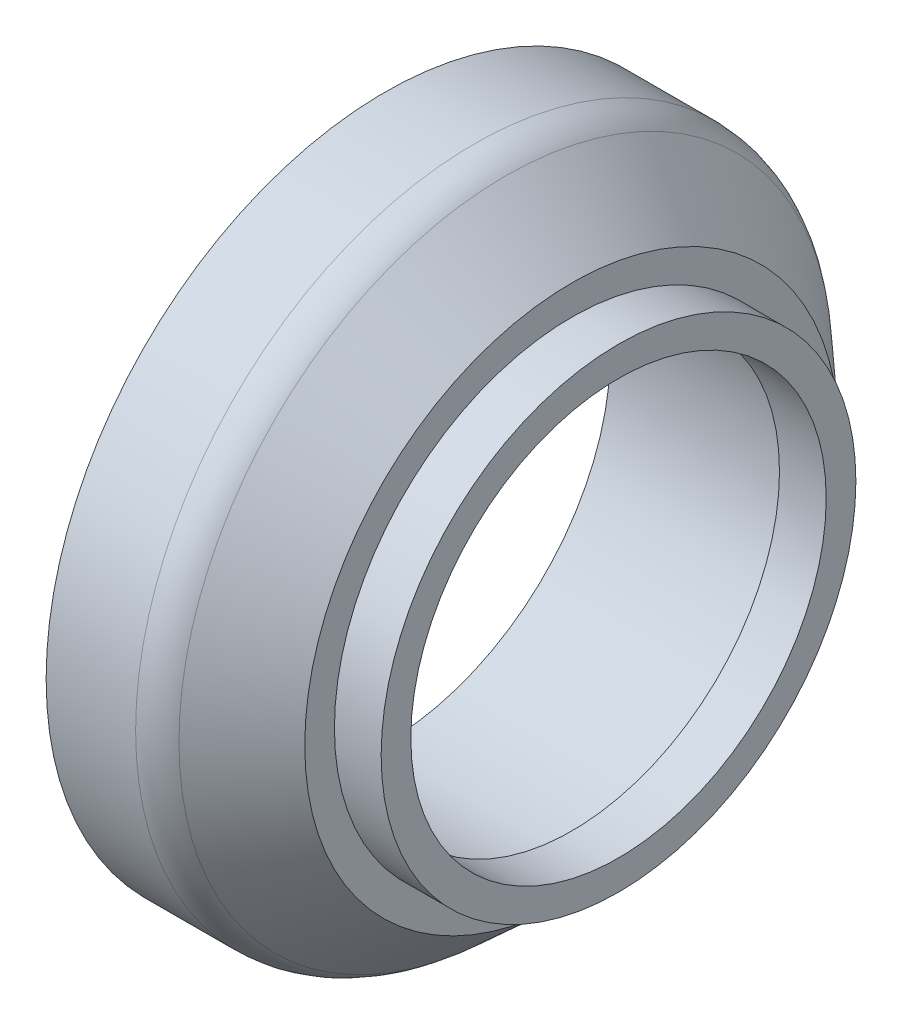
ISO-10303-21;
HEADER;
FILE_DESCRIPTION(('STEP AP214'),'2;1');
FILE_NAME('part.step','',(''),(''),'','','');
FILE_SCHEMA(('AUTOMOTIVE_DESIGN { 1 0 10303 214 1 1 1 1 }'));
ENDSEC;
DATA;
#1=APPLICATION_CONTEXT('core data for automotive mechanical design processes');
#2=APPLICATION_PROTOCOL_DEFINITION('international standard','automotive_design',2000,#1);
#3=PRODUCT_CONTEXT('',#1,'mechanical');
#4=PRODUCT('Part','Part','',(#3));
#5=PRODUCT_RELATED_PRODUCT_CATEGORY('part','',(#4));
#6=PRODUCT_DEFINITION_FORMATION('','',#4);
#7=PRODUCT_DEFINITION_CONTEXT('part definition',#1,'design');
#8=PRODUCT_DEFINITION('design','',#6,#7);
#9=PRODUCT_DEFINITION_SHAPE('','',#8);
#10=(LENGTH_UNIT() NAMED_UNIT(*) SI_UNIT(.MILLI.,.METRE.));
#11=(NAMED_UNIT(*) PLANE_ANGLE_UNIT() SI_UNIT($,.RADIAN.));
#12=(NAMED_UNIT(*) SI_UNIT($,.STERADIAN.) SOLID_ANGLE_UNIT());
#13=UNCERTAINTY_MEASURE_WITH_UNIT(LENGTH_MEASURE(1.E-05),#10,'distance_accuracy_value','');
#14=(GEOMETRIC_REPRESENTATION_CONTEXT(3) GLOBAL_UNCERTAINTY_ASSIGNED_CONTEXT((#13)) GLOBAL_UNIT_ASSIGNED_CONTEXT((#10,
#11,#12)) REPRESENTATION_CONTEXT('',''));
#15=CARTESIAN_POINT('',(0.,0.,0.));
#16=DIRECTION('',(0.,0.,1.));
#17=DIRECTION('',(1.,0.,0.));
#18=AXIS2_PLACEMENT_3D('',#15,#16,#17);
#19=CARTESIAN_POINT('',(0.,72.5,0.));
#20=DIRECTION('',(1.,0.,0.));
#21=DIRECTION('',(0.,0.,-1.));
#22=AXIS2_PLACEMENT_3D('',#19,#20,#21);
#23=PLANE('',#22);
#24=CARTESIAN_POINT('',(0.,54.1265877365278,-31.2499999999993));
#25=DIRECTION('',(1.,0.,0.));
#26=DIRECTION('',(0.,0.,-1.));
#27=AXIS2_PLACEMENT_3D('',#24,#25,#26);
#28=CIRCLE('',#27,6.35000000000002);
#29=CARTESIAN_POINT('',(0.,54.1265877365278,-37.5999999999993));
#30=VERTEX_POINT('',#29);
#31=EDGE_CURVE('E10',#30,#30,#28,.T.);
#32=ORIENTED_EDGE('',*,*,#31,.T.);
#33=EDGE_LOOP('',(#32));
#34=FACE_BOUND('',#33,.T.);
#35=CARTESIAN_POINT('',(0.,31.2500000000006,-54.126587736527));
#36=DIRECTION('',(1.,0.,0.));
#37=DIRECTION('',(0.,0.,-1.));
#38=AXIS2_PLACEMENT_3D('',#35,#36,#37);
#39=CIRCLE('',#38,6.34999999999998);
#40=CARTESIAN_POINT('',(0.,31.2500000000006,-60.476587736527));
#41=VERTEX_POINT('',#40);
#42=EDGE_CURVE('E51',#41,#41,#39,.T.);
#43=ORIENTED_EDGE('',*,*,#42,.T.);
#44=EDGE_LOOP('',(#43));
#45=FACE_BOUND('',#44,.T.);
#46=CARTESIAN_POINT('',(0.,6.54652751033088E-13,-62.5));
#47=DIRECTION('',(1.,0.,0.));
#48=DIRECTION('',(0.,0.,-1.));
#49=AXIS2_PLACEMENT_3D('',#46,#47,#48);
#50=CIRCLE('',#49,6.35000000000002);
#51=CARTESIAN_POINT('',(0.,6.54652751033088E-13,-68.85));
#52=VERTEX_POINT('',#51);
#53=EDGE_CURVE('E60',#52,#52,#50,.T.);
#54=ORIENTED_EDGE('',*,*,#53,.T.);
#55=EDGE_LOOP('',(#54));
#56=FACE_BOUND('',#55,.T.);
#57=CARTESIAN_POINT('',(0.,-31.2499999999995,-54.1265877365277));
#58=DIRECTION('',(1.,0.,0.));
#59=DIRECTION('',(0.,0.,-1.));
#60=AXIS2_PLACEMENT_3D('',#57,#58,#59);
#61=CIRCLE('',#60,6.34999999999999);
#62=CARTESIAN_POINT('',(0.,-31.2499999999995,-60.4765877365277));
#63=VERTEX_POINT('',#62);
#64=EDGE_CURVE('E66',#63,#63,#61,.T.);
#65=ORIENTED_EDGE('',*,*,#64,.T.);
#66=EDGE_LOOP('',(#65));
#67=FACE_BOUND('',#66,.T.);
#68=CARTESIAN_POINT('',(0.,-54.1265877365272,-31.2500000000004));
#69=DIRECTION('',(1.,0.,0.));
#70=DIRECTION('',(0.,0.,-1.));
#71=AXIS2_PLACEMENT_3D('',#68,#69,#70);
#72=CIRCLE('',#71,6.34999999999998);
#73=CARTESIAN_POINT('',(0.,-54.1265877365272,-37.6000000000004));
#74=VERTEX_POINT('',#73);
#75=EDGE_CURVE('E72',#74,#74,#72,.T.);
#76=ORIENTED_EDGE('',*,*,#75,.T.);
#77=EDGE_LOOP('',(#76));
#78=FACE_BOUND('',#77,.T.);
#79=CARTESIAN_POINT('',(0.,-62.5,0.));
#80=DIRECTION('',(1.,0.,0.));
#81=DIRECTION('',(0.,0.,-1.));
#82=AXIS2_PLACEMENT_3D('',#79,#80,#81);
#83=CIRCLE('',#82,6.35000000000002);
#84=CARTESIAN_POINT('',(0.,-62.5,-6.35000000000002));
#85=VERTEX_POINT('',#84);
#86=EDGE_CURVE('E78',#85,#85,#83,.T.);
#87=ORIENTED_EDGE('',*,*,#86,.T.);
#88=EDGE_LOOP('',(#87));
#89=FACE_BOUND('',#88,.T.);
#90=CARTESIAN_POINT('',(0.,-54.1265877365276,31.2499999999997));
#91=DIRECTION('',(1.,0.,0.));
#92=DIRECTION('',(0.,0.,-1.));
#93=AXIS2_PLACEMENT_3D('',#90,#91,#92);
#94=CIRCLE('',#93,6.35000000000001);
#95=CARTESIAN_POINT('',(0.,-54.1265877365276,24.8999999999997));
#96=VERTEX_POINT('',#95);
#97=EDGE_CURVE('E84',#96,#96,#94,.T.);
#98=ORIENTED_EDGE('',*,*,#97,.T.);
#99=EDGE_LOOP('',(#98));
#100=FACE_BOUND('',#99,.T.);
#101=CARTESIAN_POINT('',(0.,-31.2500000000003,54.1265877365273));
#102=DIRECTION('',(1.,0.,0.));
#103=DIRECTION('',(0.,0.,-1.));
#104=AXIS2_PLACEMENT_3D('',#101,#102,#103);
#105=CIRCLE('',#104,6.34999999999997);
#106=CARTESIAN_POINT('',(0.,-31.2500000000003,47.7765877365273));
#107=VERTEX_POINT('',#106);
#108=EDGE_CURVE('E90',#107,#107,#105,.T.);
#109=ORIENTED_EDGE('',*,*,#108,.T.);
#110=EDGE_LOOP('',(#109));
#111=FACE_BOUND('',#110,.T.);
#112=CARTESIAN_POINT('',(0.,-2.18217583677696E-13,62.5));
#113=DIRECTION('',(1.,0.,0.));
#114=DIRECTION('',(0.,0.,-1.));
#115=AXIS2_PLACEMENT_3D('',#112,#113,#114);
#116=CIRCLE('',#115,6.35000000000002);
#117=CARTESIAN_POINT('',(0.,-2.18217583677696E-13,56.15));
#118=VERTEX_POINT('',#117);
#119=EDGE_CURVE('E96',#118,#118,#116,.T.);
#120=ORIENTED_EDGE('',*,*,#119,.T.);
#121=EDGE_LOOP('',(#120));
#122=FACE_BOUND('',#121,.T.);
#123=CARTESIAN_POINT('',(0.,31.2499999999999,54.1265877365275));
#124=DIRECTION('',(1.,0.,0.));
#125=DIRECTION('',(0.,0.,-1.));
#126=AXIS2_PLACEMENT_3D('',#123,#124,#125);
#127=CIRCLE('',#126,6.34999999999997);
#128=CARTESIAN_POINT('',(0.,31.2499999999999,47.7765877365275));
#129=VERTEX_POINT('',#128);
#130=EDGE_CURVE('E102',#129,#129,#127,.T.);
#131=ORIENTED_EDGE('',*,*,#130,.T.);
#132=EDGE_LOOP('',(#131));
#133=FACE_BOUND('',#132,.T.);
#134=CARTESIAN_POINT('',(0.,54.1265877365274,31.2500000000001));
#135=DIRECTION('',(1.,0.,0.));
#136=DIRECTION('',(0.,0.,-1.));
#137=AXIS2_PLACEMENT_3D('',#134,#135,#136);
#138=CIRCLE('',#137,6.35000000000001);
#139=CARTESIAN_POINT('',(0.,54.1265877365274,24.9000000000001));
#140=VERTEX_POINT('',#139);
#141=EDGE_CURVE('E108',#140,#140,#138,.T.);
#142=ORIENTED_EDGE('',*,*,#141,.T.);
#143=EDGE_LOOP('',(#142));
#144=FACE_BOUND('',#143,.T.);
#145=CARTESIAN_POINT('',(0.,62.5,0.));
#146=DIRECTION('',(1.,0.,0.));
#147=DIRECTION('',(0.,0.,-1.));
#148=AXIS2_PLACEMENT_3D('',#145,#146,#147);
#149=CIRCLE('',#148,6.35000000000002);
#150=CARTESIAN_POINT('',(0.,62.5,-6.35000000000002));
#151=VERTEX_POINT('',#150);
#152=EDGE_CURVE('E114',#151,#151,#149,.T.);
#153=ORIENTED_EDGE('',*,*,#152,.T.);
#154=EDGE_LOOP('',(#153));
#155=FACE_BOUND('',#154,.T.);
#156=CARTESIAN_POINT('',(0.,0.,0.));
#157=DIRECTION('',(-1.,0.,0.));
#158=DIRECTION('',(0.,0.,1.));
#159=AXIS2_PLACEMENT_3D('',#156,#157,#158);
#160=CIRCLE('',#159,48.25);
#161=CARTESIAN_POINT('',(0.,0.,48.25));
#162=VERTEX_POINT('',#161);
#163=EDGE_CURVE('E129',#162,#162,#160,.T.);
#164=ORIENTED_EDGE('',*,*,#163,.F.);
#165=EDGE_LOOP('',(#164));
#166=FACE_BOUND('',#165,.T.);
#167=CARTESIAN_POINT('',(0.,0.,0.));
#168=DIRECTION('',(-1.,0.,0.));
#169=DIRECTION('',(0.,0.,1.));
#170=AXIS2_PLACEMENT_3D('',#167,#168,#169);
#171=CIRCLE('',#170,72.5);
#172=CARTESIAN_POINT('',(0.,0.,72.5));
#173=VERTEX_POINT('',#172);
#174=EDGE_CURVE('E138',#173,#173,#171,.T.);
#175=ORIENTED_EDGE('',*,*,#174,.T.);
#176=EDGE_LOOP('',(#175));
#177=FACE_BOUND('',#176,.T.);
#178=ADVANCED_FACE('F39',(#34,#45,#56,#67,#78,#89,#100,#111,#122,#133,#144,#155,#166,#177),#23,.F.);
#179=CARTESIAN_POINT('',(0.,0.,0.));
#180=DIRECTION('',(-1.,0.,0.));
#181=DIRECTION('',(0.,0.,1.));
#182=AXIS2_PLACEMENT_3D('',#179,#180,#181);
#183=CYLINDRICAL_SURFACE('',#182,48.25);
#184=CARTESIAN_POINT('',(40.,0.,0.));
#185=DIRECTION('',(-1.,0.,0.));
#186=DIRECTION('',(0.,0.,1.));
#187=AXIS2_PLACEMENT_3D('',#184,#185,#186);
#188=CIRCLE('',#187,48.25);
#189=CARTESIAN_POINT('',(40.,0.,48.25));
#190=VERTEX_POINT('',#189);
#191=EDGE_CURVE('E132',#190,#190,#188,.T.);
#192=ORIENTED_EDGE('',*,*,#191,.F.);
#193=EDGE_LOOP('',(#192));
#194=FACE_BOUND('',#193,.T.);
#195=ORIENTED_EDGE('',*,*,#163,.T.);
#196=EDGE_LOOP('',(#195));
#197=FACE_BOUND('',#196,.T.);
#198=ADVANCED_FACE('F204',(#194,#197),#183,.F.);
#199=CARTESIAN_POINT('',(40.,48.25,0.));
#200=DIRECTION('',(-1.,0.,0.));
#201=DIRECTION('',(0.,0.,1.));
#202=AXIS2_PLACEMENT_3D('',#199,#200,#201);
#203=PLANE('',#202);
#204=CARTESIAN_POINT('',(40.,0.,0.));
#205=DIRECTION('',(-1.,0.,0.));
#206=DIRECTION('',(0.,0.,1.));
#207=AXIS2_PLACEMENT_3D('',#204,#205,#206);
#208=CIRCLE('',#207,50.8);
#209=CARTESIAN_POINT('',(40.,0.,50.8));
#210=VERTEX_POINT('',#209);
#211=EDGE_CURVE('E120',#210,#210,#208,.F.);
#212=ORIENTED_EDGE('',*,*,#211,.F.);
#213=EDGE_LOOP('',(#212));
#214=FACE_BOUND('',#213,.T.);
#215=CARTESIAN_POINT('',(40.,0.,0.));
#216=DIRECTION('',(-1.,0.,0.));
#217=DIRECTION('',(0.,0.,1.));
#218=AXIS2_PLACEMENT_3D('',#215,#216,#217);
#219=CIRCLE('',#218,57.15);
#220=CARTESIAN_POINT('',(40.,0.,57.15));
#221=VERTEX_POINT('',#220);
#222=EDGE_CURVE('E135',#221,#221,#219,.T.);
#223=ORIENTED_EDGE('',*,*,#222,.F.);
#224=EDGE_LOOP('',(#223));
#225=FACE_BOUND('',#224,.T.);
#226=ADVANCED_FACE('F209',(#214,#225),#203,.F.);
#227=CARTESIAN_POINT('',(40.,0.,0.));
#228=DIRECTION('',(-1.,0.,0.));
#229=DIRECTION('',(0.,0.,1.));
#230=AXIS2_PLACEMENT_3D('',#227,#228,#229);
#231=CONICAL_SURFACE('',#230,57.15,0.73443768676526);
#232=CARTESIAN_POINT('',(25.8550285509689,0.,0.));
#233=DIRECTION('',(1.,0.,0.));
#234=DIRECTION('',(0.,0.,-1.));
#235=AXIS2_PLACEMENT_3D('',#232,#233,#234);
#236=CIRCLE('',#235,69.922077161331);
#237=CARTESIAN_POINT('',(25.8550285509689,0.,-69.922077161331));
#238=VERTEX_POINT('',#237);
#239=EDGE_CURVE('E123',#238,#238,#236,.T.);
#240=ORIENTED_EDGE('',*,*,#239,.T.);
#241=EDGE_LOOP('',(#240));
#242=FACE_BOUND('',#241,.T.);
#243=ORIENTED_EDGE('',*,*,#222,.T.);
#244=EDGE_LOOP('',(#243));
#245=FACE_BOUND('',#244,.T.);
#246=ADVANCED_FACE('F332',(#242,#245),#231,.T.);
#247=CARTESIAN_POINT('',(0.,0.,0.));
#248=DIRECTION('',(-1.,0.,0.));
#249=DIRECTION('',(0.,0.,1.));
#250=AXIS2_PLACEMENT_3D('',#247,#248,#249);
#251=CYLINDRICAL_SURFACE('',#250,72.5);
#252=CARTESIAN_POINT('',(19.1533294670613,0.,0.));
#253=DIRECTION('',(1.,0.,0.));
#254=DIRECTION('',(0.,0.,-1.));
#255=AXIS2_PLACEMENT_3D('',#252,#253,#254);
#256=CIRCLE('',#255,72.5);
#257=CARTESIAN_POINT('',(19.1533294670613,0.,-72.5));
#258=VERTEX_POINT('',#257);
#259=EDGE_CURVE('E126',#258,#258,#256,.F.);
#260=ORIENTED_EDGE('',*,*,#259,.T.);
#261=EDGE_LOOP('',(#260));
#262=FACE_BOUND('',#261,.T.);
#263=ORIENTED_EDGE('',*,*,#174,.F.);
#264=EDGE_LOOP('',(#263));
#265=FACE_BOUND('',#264,.T.);
#266=ADVANCED_FACE('F219',(#262,#265),#251,.T.);
#267=CARTESIAN_POINT('',(19.1533294670613,0.,0.));
#268=DIRECTION('',(1.,0.,0.));
#269=DIRECTION('',(0.,0.,-1.));
#270=AXIS2_PLACEMENT_3D('',#267,#268,#269);
#271=TOROIDAL_SURFACE('',#270,62.5,10.);
#272=ORIENTED_EDGE('',*,*,#239,.F.);
#273=EDGE_LOOP('',(#272));
#274=FACE_BOUND('',#273,.T.);
#275=ORIENTED_EDGE('',*,*,#259,.F.);
#276=EDGE_LOOP('',(#275));
#277=FACE_BOUND('',#276,.T.);
#278=ADVANCED_FACE('F215',(#274,#277),#271,.T.);
#279=CARTESIAN_POINT('',(40.,0.,0.));
#280=DIRECTION('',(1.,0.,0.));
#281=DIRECTION('',(0.,0.,-1.));
#282=AXIS2_PLACEMENT_3D('',#279,#280,#281);
#283=PLANE('',#282);
#284=CARTESIAN_POINT('',(40.,0.,0.));
#285=DIRECTION('',(1.,0.,0.));
#286=DIRECTION('',(0.,0.,-1.));
#287=AXIS2_PLACEMENT_3D('',#284,#285,#286);
#288=CIRCLE('',#287,44.45);
#289=CARTESIAN_POINT('',(40.,0.,-44.45));
#290=VERTEX_POINT('',#289);
#291=EDGE_CURVE('E145',#290,#290,#288,.T.);
#292=ORIENTED_EDGE('',*,*,#291,.T.);
#293=EDGE_LOOP('',(#292));
#294=FACE_BOUND('',#293,.T.);
#295=ORIENTED_EDGE('',*,*,#191,.T.);
#296=EDGE_LOOP('',(#295));
#297=FACE_BOUND('',#296,.T.);
#298=ADVANCED_FACE('F218',(#294,#297),#283,.F.);
#299=CARTESIAN_POINT('',(50.,0.,0.));
#300=DIRECTION('',(1.,0.,0.));
#301=DIRECTION('',(0.,0.,-1.));
#302=AXIS2_PLACEMENT_3D('',#299,#300,#301);
#303=PLANE('',#302);
#304=CARTESIAN_POINT('',(50.,0.,0.));
#305=DIRECTION('',(1.,0.,0.));
#306=DIRECTION('',(0.,0.,-1.));
#307=AXIS2_PLACEMENT_3D('',#304,#305,#306);
#308=CIRCLE('',#307,50.8);
#309=CARTESIAN_POINT('',(50.,0.,-50.8));
#310=VERTEX_POINT('',#309);
#311=EDGE_CURVE('E141',#310,#310,#308,.T.);
#312=ORIENTED_EDGE('',*,*,#311,.T.);
#313=EDGE_LOOP('',(#312));
#314=FACE_BOUND('',#313,.T.);
#315=CARTESIAN_POINT('',(50.,0.,0.));
#316=DIRECTION('',(1.,0.,0.));
#317=DIRECTION('',(0.,0.,-1.));
#318=AXIS2_PLACEMENT_3D('',#315,#316,#317);
#319=CIRCLE('',#318,44.45);
#320=CARTESIAN_POINT('',(50.,0.,-44.45));
#321=VERTEX_POINT('',#320);
#322=EDGE_CURVE('E144',#321,#321,#319,.T.);
#323=ORIENTED_EDGE('',*,*,#322,.F.);
#324=EDGE_LOOP('',(#323));
#325=FACE_BOUND('',#324,.T.);
#326=ADVANCED_FACE('F354',(#314,#325),#303,.T.);
#327=CARTESIAN_POINT('',(50.,0.,0.));
#328=DIRECTION('',(-1.,0.,0.));
#329=DIRECTION('',(0.,0.,1.));
#330=AXIS2_PLACEMENT_3D('',#327,#328,#329);
#331=CYLINDRICAL_SURFACE('',#330,50.8);
#332=ORIENTED_EDGE('',*,*,#311,.F.);
#333=EDGE_LOOP('',(#332));
#334=FACE_BOUND('',#333,.T.);
#335=ORIENTED_EDGE('',*,*,#211,.T.);
#336=EDGE_LOOP('',(#335));
#337=FACE_BOUND('',#336,.T.);
#338=ADVANCED_FACE('F341',(#334,#337),#331,.T.);
#339=CARTESIAN_POINT('',(50.,0.,0.));
#340=DIRECTION('',(-1.,0.,0.));
#341=DIRECTION('',(0.,0.,1.));
#342=AXIS2_PLACEMENT_3D('',#339,#340,#341);
#343=CYLINDRICAL_SURFACE('',#342,44.45);
#344=ORIENTED_EDGE('',*,*,#322,.T.);
#345=EDGE_LOOP('',(#344));
#346=FACE_BOUND('',#345,.T.);
#347=ORIENTED_EDGE('',*,*,#291,.F.);
#348=EDGE_LOOP('',(#347));
#349=FACE_BOUND('',#348,.T.);
#350=ADVANCED_FACE('F353',(#346,#349),#343,.F.);
#351=CARTESIAN_POINT('',(19.4,62.5,0.));
#352=DIRECTION('',(-1.,0.,0.));
#353=DIRECTION('',(0.,0.,1.));
#354=AXIS2_PLACEMENT_3D('',#351,#352,#353);
#355=CYLINDRICAL_SURFACE('',#354,5.35);
#356=CARTESIAN_POINT('',(0.999999999999984,62.5,0.));
#357=DIRECTION('',(1.,0.,0.));
#358=DIRECTION('',(0.,0.,-1.));
#359=AXIS2_PLACEMENT_3D('',#356,#357,#358);
#360=CIRCLE('',#359,5.35);
#361=CARTESIAN_POINT('',(0.999999999999984,62.5,-5.35));
#362=VERTEX_POINT('',#361);
#363=EDGE_CURVE('E117',#362,#362,#360,.F.);
#364=ORIENTED_EDGE('',*,*,#363,.T.);
#365=EDGE_LOOP('',(#364));
#366=FACE_BOUND('',#365,.T.);
#367=CARTESIAN_POINT('',(19.4,62.5,0.));
#368=DIRECTION('',(-1.,0.,0.));
#369=DIRECTION('',(0.,0.,1.));
#370=AXIS2_PLACEMENT_3D('',#367,#368,#369);
#371=CIRCLE('',#370,5.35);
#372=CARTESIAN_POINT('',(19.4,62.5,5.35));
#373=VERTEX_POINT('',#372);
#374=EDGE_CURVE('E148',#373,#373,#371,.T.);
#375=ORIENTED_EDGE('',*,*,#374,.F.);
#376=EDGE_LOOP('',(#375));
#377=FACE_BOUND('',#376,.T.);
#378=ADVANCED_FACE('F360',(#366,#377),#355,.F.);
#379=CARTESIAN_POINT('',(19.4,62.5,0.));
#380=DIRECTION('',(-1.,0.,0.));
#381=DIRECTION('',(0.,0.,1.));
#382=AXIS2_PLACEMENT_3D('',#379,#380,#381);
#383=PLANE('',#382);
#384=ORIENTED_EDGE('',*,*,#374,.T.);
#385=EDGE_LOOP('',(#384));
#386=FACE_BOUND('',#385,.T.);
#387=ADVANCED_FACE('F229',(#386),#383,.T.);
#388=CARTESIAN_POINT('',(0.999999999999984,62.5,0.));
#389=DIRECTION('',(-1.,0.,0.));
#390=DIRECTION('',(0.,0.,1.));
#391=AXIS2_PLACEMENT_3D('',#388,#389,#390);
#392=CONICAL_SURFACE('',#391,5.35,0.785398163397467);
#393=ORIENTED_EDGE('',*,*,#152,.F.);
#394=EDGE_LOOP('',(#393));
#395=FACE_BOUND('',#394,.T.);
#396=ORIENTED_EDGE('',*,*,#363,.F.);
#397=EDGE_LOOP('',(#396));
#398=FACE_BOUND('',#397,.T.);
#399=ADVANCED_FACE('F222',(#395,#398),#392,.F.);
#400=CARTESIAN_POINT('',(19.4,54.1265877365274,31.2500000000001));
#401=DIRECTION('',(-1.,0.,0.));
#402=DIRECTION('',(0.,0.,1.));
#403=AXIS2_PLACEMENT_3D('',#400,#401,#402);
#404=CYLINDRICAL_SURFACE('',#403,5.35);
#405=CARTESIAN_POINT('',(0.999999999999984,54.1265877365274,31.2500000000001));
#406=DIRECTION('',(1.,0.,0.));
#407=DIRECTION('',(0.,0.,-1.));
#408=AXIS2_PLACEMENT_3D('',#405,#406,#407);
#409=CIRCLE('',#408,5.35);
#410=CARTESIAN_POINT('',(0.999999999999984,54.1265877365274,25.9000000000001));
#411=VERTEX_POINT('',#410);
#412=EDGE_CURVE('E111',#411,#411,#409,.F.);
#413=ORIENTED_EDGE('',*,*,#412,.T.);
#414=EDGE_LOOP('',(#413));
#415=FACE_BOUND('',#414,.T.);
#416=CARTESIAN_POINT('',(19.4,54.1265877365274,31.2500000000001));
#417=DIRECTION('',(-1.,0.,0.));
#418=DIRECTION('',(0.,-0.500000000000001,0.866025403784438));
#419=AXIS2_PLACEMENT_3D('',#416,#417,#418);
#420=CIRCLE('',#419,5.35);
#421=CARTESIAN_POINT('',(19.4,51.4515877365274,35.8832359102468));
#422=VERTEX_POINT('',#421);
#423=EDGE_CURVE('E153',#422,#422,#420,.T.);
#424=ORIENTED_EDGE('',*,*,#423,.F.);
#425=EDGE_LOOP('',(#424));
#426=FACE_BOUND('',#425,.T.);
#427=ADVANCED_FACE('F228',(#415,#426),#404,.F.);
#428=CARTESIAN_POINT('',(19.4,54.1265877365274,31.2500000000001));
#429=DIRECTION('',(-1.,0.,0.));
#430=DIRECTION('',(0.,-0.500000000000001,0.866025403784438));
#431=AXIS2_PLACEMENT_3D('',#428,#429,#430);
#432=PLANE('',#431);
#433=ORIENTED_EDGE('',*,*,#423,.T.);
#434=EDGE_LOOP('',(#433));
#435=FACE_BOUND('',#434,.T.);
#436=ADVANCED_FACE('F386',(#435),#432,.T.);
#437=CARTESIAN_POINT('',(19.4,54.1265877365278,-31.2499999999993));
#438=DIRECTION('',(-1.,0.,0.));
#439=DIRECTION('',(0.,0.,1.));
#440=AXIS2_PLACEMENT_3D('',#437,#438,#439);
#441=CYLINDRICAL_SURFACE('',#440,5.35);
#442=CARTESIAN_POINT('',(0.999999999999987,54.1265877365278,-31.2499999999993));
#443=DIRECTION('',(1.,0.,0.));
#444=DIRECTION('',(0.,0.,-1.));
#445=AXIS2_PLACEMENT_3D('',#442,#443,#444);
#446=CIRCLE('',#445,5.35);
#447=CARTESIAN_POINT('',(0.999999999999987,54.1265877365278,-36.5999999999993));
#448=VERTEX_POINT('',#447);
#449=EDGE_CURVE('E47',#448,#448,#446,.F.);
#450=ORIENTED_EDGE('',*,*,#449,.T.);
#451=EDGE_LOOP('',(#450));
#452=FACE_BOUND('',#451,.T.);
#453=CARTESIAN_POINT('',(19.4,54.1265877365278,-31.2499999999993));
#454=DIRECTION('',(-1.,0.,0.));
#455=DIRECTION('',(0.,0.499999999999989,0.866025403784445));
#456=AXIS2_PLACEMENT_3D('',#453,#454,#455);
#457=CIRCLE('',#456,5.35);
#458=CARTESIAN_POINT('',(19.4,56.8015877365278,-26.6167640897525));
#459=VERTEX_POINT('',#458);
#460=EDGE_CURVE('E181',#459,#459,#457,.T.);
#461=ORIENTED_EDGE('',*,*,#460,.F.);
#462=EDGE_LOOP('',(#461));
#463=FACE_BOUND('',#462,.T.);
#464=ADVANCED_FACE('F200',(#452,#463),#441,.F.);
#465=CARTESIAN_POINT('',(19.4,54.1265877365278,-31.2499999999993));
#466=DIRECTION('',(-1.,0.,0.));
#467=DIRECTION('',(0.,0.499999999999989,0.866025403784445));
#468=AXIS2_PLACEMENT_3D('',#465,#466,#467);
#469=PLANE('',#468);
#470=ORIENTED_EDGE('',*,*,#460,.T.);
#471=EDGE_LOOP('',(#470));
#472=FACE_BOUND('',#471,.T.);
#473=ADVANCED_FACE('F191',(#472),#469,.T.);
#474=CARTESIAN_POINT('',(19.4,31.2500000000006,-54.126587736527));
#475=DIRECTION('',(-1.,0.,0.));
#476=DIRECTION('',(0.,0.,1.));
#477=AXIS2_PLACEMENT_3D('',#474,#475,#476);
#478=CYLINDRICAL_SURFACE('',#477,5.35);
#479=CARTESIAN_POINT('',(0.999999999999956,31.2500000000006,-54.126587736527));
#480=DIRECTION('',(1.,0.,0.));
#481=DIRECTION('',(0.,0.,-1.));
#482=AXIS2_PLACEMENT_3D('',#479,#480,#481);
#483=CIRCLE('',#482,5.35);
#484=CARTESIAN_POINT('',(0.999999999999956,31.2500000000006,-59.4765877365271));
#485=VERTEX_POINT('',#484);
#486=EDGE_CURVE('E55',#485,#485,#483,.F.);
#487=ORIENTED_EDGE('',*,*,#486,.T.);
#488=EDGE_LOOP('',(#487));
#489=FACE_BOUND('',#488,.T.);
#490=CARTESIAN_POINT('',(19.4,31.2500000000006,-54.126587736527));
#491=DIRECTION('',(-1.,0.,0.));
#492=DIRECTION('',(0.,0.866025403784433,0.50000000000001));
#493=AXIS2_PLACEMENT_3D('',#490,#491,#492);
#494=CIRCLE('',#493,5.35);
#495=CARTESIAN_POINT('',(19.4,35.8832359102474,-51.451587736527));
#496=VERTEX_POINT('',#495);
#497=EDGE_CURVE('E161',#496,#496,#494,.T.);
#498=ORIENTED_EDGE('',*,*,#497,.F.);
#499=EDGE_LOOP('',(#498));
#500=FACE_BOUND('',#499,.T.);
#501=ADVANCED_FACE('F189',(#489,#500),#478,.F.);
#502=CARTESIAN_POINT('',(19.4,31.2500000000006,-54.126587736527));
#503=DIRECTION('',(-1.,0.,0.));
#504=DIRECTION('',(0.,0.866025403784433,0.50000000000001));
#505=AXIS2_PLACEMENT_3D('',#502,#503,#504);
#506=PLANE('',#505);
#507=ORIENTED_EDGE('',*,*,#497,.T.);
#508=EDGE_LOOP('',(#507));
#509=FACE_BOUND('',#508,.T.);
#510=ADVANCED_FACE('F187',(#509),#506,.T.);
#511=CARTESIAN_POINT('',(19.4,6.54652751033088E-13,-62.5));
#512=DIRECTION('',(-1.,0.,0.));
#513=DIRECTION('',(0.,0.,1.));
#514=AXIS2_PLACEMENT_3D('',#511,#512,#513);
#515=CYLINDRICAL_SURFACE('',#514,5.35);
#516=CARTESIAN_POINT('',(0.999999999999984,6.54652751033088E-13,-62.5));
#517=DIRECTION('',(1.,0.,0.));
#518=DIRECTION('',(0.,0.,-1.));
#519=AXIS2_PLACEMENT_3D('',#516,#517,#518);
#520=CIRCLE('',#519,5.35);
#521=CARTESIAN_POINT('',(0.999999999999984,6.54652751033088E-13,-67.85));
#522=VERTEX_POINT('',#521);
#523=EDGE_CURVE('E63',#522,#522,#520,.F.);
#524=ORIENTED_EDGE('',*,*,#523,.T.);
#525=EDGE_LOOP('',(#524));
#526=FACE_BOUND('',#525,.T.);
#527=CARTESIAN_POINT('',(19.4,6.54652751033088E-13,-62.5));
#528=DIRECTION('',(-1.,0.,0.));
#529=DIRECTION('',(0.,1.,0.));
#530=AXIS2_PLACEMENT_3D('',#527,#528,#529);
#531=CIRCLE('',#530,5.35);
#532=CARTESIAN_POINT('',(19.4,5.35000000000065,-62.4999999999999));
#533=VERTEX_POINT('',#532);
#534=EDGE_CURVE('E157',#533,#533,#531,.T.);
#535=ORIENTED_EDGE('',*,*,#534,.F.);
#536=EDGE_LOOP('',(#535));
#537=FACE_BOUND('',#536,.T.);
#538=ADVANCED_FACE('F198',(#526,#537),#515,.F.);
#539=CARTESIAN_POINT('',(19.4,6.54652751033088E-13,-62.5));
#540=DIRECTION('',(-1.,0.,0.));
#541=DIRECTION('',(0.,1.,0.));
#542=AXIS2_PLACEMENT_3D('',#539,#540,#541);
#543=PLANE('',#542);
#544=ORIENTED_EDGE('',*,*,#534,.T.);
#545=EDGE_LOOP('',(#544));
#546=FACE_BOUND('',#545,.T.);
#547=ADVANCED_FACE('F393',(#546),#543,.T.);
#548=CARTESIAN_POINT('',(19.4,-31.2499999999995,-54.1265877365277));
#549=DIRECTION('',(-1.,0.,0.));
#550=DIRECTION('',(0.,0.,1.));
#551=AXIS2_PLACEMENT_3D('',#548,#549,#550);
#552=CYLINDRICAL_SURFACE('',#551,5.35);
#553=CARTESIAN_POINT('',(0.999999999999984,-31.2499999999995,-54.1265877365277));
#554=DIRECTION('',(1.,0.,0.));
#555=DIRECTION('',(0.,0.,-1.));
#556=AXIS2_PLACEMENT_3D('',#553,#554,#555);
#557=CIRCLE('',#556,5.35);
#558=CARTESIAN_POINT('',(0.999999999999984,-31.2499999999995,-59.4765877365277));
#559=VERTEX_POINT('',#558);
#560=EDGE_CURVE('E69',#559,#559,#557,.F.);
#561=ORIENTED_EDGE('',*,*,#560,.T.);
#562=EDGE_LOOP('',(#561));
#563=FACE_BOUND('',#562,.T.);
#564=CARTESIAN_POINT('',(19.4,-31.2499999999995,-54.1265877365277));
#565=DIRECTION('',(-1.,0.,0.));
#566=DIRECTION('',(0.,0.866025403784443,-0.499999999999992));
#567=AXIS2_PLACEMENT_3D('',#564,#565,#566);
#568=CIRCLE('',#567,5.35);
#569=CARTESIAN_POINT('',(19.4,-26.6167640897527,-56.8015877365277));
#570=VERTEX_POINT('',#569);
#571=EDGE_CURVE('E160',#570,#570,#568,.T.);
#572=ORIENTED_EDGE('',*,*,#571,.F.);
#573=EDGE_LOOP('',(#572));
#574=FACE_BOUND('',#573,.T.);
#575=ADVANCED_FACE('F397',(#563,#574),#552,.F.);
#576=CARTESIAN_POINT('',(19.4,-31.2499999999995,-54.1265877365277));
#577=DIRECTION('',(-1.,0.,0.));
#578=DIRECTION('',(0.,0.866025403784443,-0.499999999999992));
#579=AXIS2_PLACEMENT_3D('',#576,#577,#578);
#580=PLANE('',#579);
#581=ORIENTED_EDGE('',*,*,#571,.T.);
#582=EDGE_LOOP('',(#581));
#583=FACE_BOUND('',#582,.T.);
#584=ADVANCED_FACE('F401',(#583),#580,.T.);
#585=CARTESIAN_POINT('',(19.4,-54.1265877365272,-31.2500000000004));
#586=DIRECTION('',(-1.,0.,0.));
#587=DIRECTION('',(0.,0.,1.));
#588=AXIS2_PLACEMENT_3D('',#585,#586,#587);
#589=CYLINDRICAL_SURFACE('',#588,5.35);
#590=CARTESIAN_POINT('',(0.999999999999956,-54.1265877365272,-31.2500000000004));
#591=DIRECTION('',(1.,0.,0.));
#592=DIRECTION('',(0.,0.,-1.));
#593=AXIS2_PLACEMENT_3D('',#590,#591,#592);
#594=CIRCLE('',#593,5.35);
#595=CARTESIAN_POINT('',(0.999999999999956,-54.1265877365272,-36.6000000000004));
#596=VERTEX_POINT('',#595);
#597=EDGE_CURVE('E75',#596,#596,#594,.F.);
#598=ORIENTED_EDGE('',*,*,#597,.T.);
#599=EDGE_LOOP('',(#598));
#600=FACE_BOUND('',#599,.T.);
#601=CARTESIAN_POINT('',(19.4,-54.1265877365272,-31.2500000000004));
#602=DIRECTION('',(-1.,0.,0.));
#603=DIRECTION('',(0.,0.500000000000007,-0.866025403784435));
#604=AXIS2_PLACEMENT_3D('',#601,#602,#603);
#605=CIRCLE('',#604,5.35);
#606=CARTESIAN_POINT('',(19.4,-51.4515877365271,-35.8832359102472));
#607=VERTEX_POINT('',#606);
#608=EDGE_CURVE('E164',#607,#607,#605,.T.);
#609=ORIENTED_EDGE('',*,*,#608,.F.);
#610=EDGE_LOOP('',(#609));
#611=FACE_BOUND('',#610,.T.);
#612=ADVANCED_FACE('F405',(#600,#611),#589,.F.);
#613=CARTESIAN_POINT('',(19.4,-54.1265877365272,-31.2500000000004));
#614=DIRECTION('',(-1.,0.,0.));
#615=DIRECTION('',(0.,0.500000000000007,-0.866025403784435));
#616=AXIS2_PLACEMENT_3D('',#613,#614,#615);
#617=PLANE('',#616);
#618=ORIENTED_EDGE('',*,*,#608,.T.);
#619=EDGE_LOOP('',(#618));
#620=FACE_BOUND('',#619,.T.);
#621=ADVANCED_FACE('F409',(#620),#617,.T.);
#622=CARTESIAN_POINT('',(19.4,-62.5,0.));
#623=DIRECTION('',(-1.,0.,0.));
#624=DIRECTION('',(0.,0.,1.));
#625=AXIS2_PLACEMENT_3D('',#622,#623,#624);
#626=CYLINDRICAL_SURFACE('',#625,5.35);
#627=CARTESIAN_POINT('',(0.999999999999984,-62.5,0.));
#628=DIRECTION('',(1.,0.,0.));
#629=DIRECTION('',(0.,0.,-1.));
#630=AXIS2_PLACEMENT_3D('',#627,#628,#629);
#631=CIRCLE('',#630,5.35);
#632=CARTESIAN_POINT('',(0.999999999999984,-62.5,-5.35));
#633=VERTEX_POINT('',#632);
#634=EDGE_CURVE('E81',#633,#633,#631,.F.);
#635=ORIENTED_EDGE('',*,*,#634,.T.);
#636=EDGE_LOOP('',(#635));
#637=FACE_BOUND('',#636,.T.);
#638=CARTESIAN_POINT('',(19.4,-62.5,0.));
#639=DIRECTION('',(-1.,0.,0.));
#640=DIRECTION('',(0.,0.,-1.));
#641=AXIS2_PLACEMENT_3D('',#638,#639,#640);
#642=CIRCLE('',#641,5.35);
#643=CARTESIAN_POINT('',(19.4,-62.5,-5.35));
#644=VERTEX_POINT('',#643);
#645=EDGE_CURVE('E167',#644,#644,#642,.T.);
#646=ORIENTED_EDGE('',*,*,#645,.F.);
#647=EDGE_LOOP('',(#646));
#648=FACE_BOUND('',#647,.T.);
#649=ADVANCED_FACE('F413',(#637,#648),#626,.F.);
#650=CARTESIAN_POINT('',(19.4,-62.5,0.));
#651=DIRECTION('',(-1.,0.,0.));
#652=DIRECTION('',(0.,0.,-1.));
#653=AXIS2_PLACEMENT_3D('',#650,#651,#652);
#654=PLANE('',#653);
#655=ORIENTED_EDGE('',*,*,#645,.T.);
#656=EDGE_LOOP('',(#655));
#657=FACE_BOUND('',#656,.T.);
#658=ADVANCED_FACE('F417',(#657),#654,.T.);
#659=CARTESIAN_POINT('',(19.4,-54.1265877365276,31.2499999999997));
#660=DIRECTION('',(-1.,0.,0.));
#661=DIRECTION('',(0.,0.,1.));
#662=AXIS2_PLACEMENT_3D('',#659,#660,#661);
#663=CYLINDRICAL_SURFACE('',#662,5.35);
#664=CARTESIAN_POINT('',(0.999999999999984,-54.1265877365276,31.2499999999997));
#665=DIRECTION('',(1.,0.,0.));
#666=DIRECTION('',(0.,0.,-1.));
#667=AXIS2_PLACEMENT_3D('',#664,#665,#666);
#668=CIRCLE('',#667,5.35);
#669=CARTESIAN_POINT('',(0.999999999999984,-54.1265877365276,25.8999999999997));
#670=VERTEX_POINT('',#669);
#671=EDGE_CURVE('E87',#670,#670,#668,.F.);
#672=ORIENTED_EDGE('',*,*,#671,.T.);
#673=EDGE_LOOP('',(#672));
#674=FACE_BOUND('',#673,.T.);
#675=CARTESIAN_POINT('',(19.4,-54.1265877365276,31.2499999999997));
#676=DIRECTION('',(-1.,0.,0.));
#677=DIRECTION('',(0.,-0.499999999999995,-0.866025403784442));
#678=AXIS2_PLACEMENT_3D('',#675,#676,#677);
#679=CIRCLE('',#678,5.35);
#680=CARTESIAN_POINT('',(19.4,-56.8015877365276,26.6167640897529));
#681=VERTEX_POINT('',#680);
#682=EDGE_CURVE('E170',#681,#681,#679,.T.);
#683=ORIENTED_EDGE('',*,*,#682,.F.);
#684=EDGE_LOOP('',(#683));
#685=FACE_BOUND('',#684,.T.);
#686=ADVANCED_FACE('F421',(#674,#685),#663,.F.);
#687=CARTESIAN_POINT('',(19.4,-54.1265877365276,31.2499999999997));
#688=DIRECTION('',(-1.,0.,0.));
#689=DIRECTION('',(0.,-0.499999999999995,-0.866025403784442));
#690=AXIS2_PLACEMENT_3D('',#687,#688,#689);
#691=PLANE('',#690);
#692=ORIENTED_EDGE('',*,*,#682,.T.);
#693=EDGE_LOOP('',(#692));
#694=FACE_BOUND('',#693,.T.);
#695=ADVANCED_FACE('F425',(#694),#691,.T.);
#696=CARTESIAN_POINT('',(19.4,-31.2500000000003,54.1265877365273));
#697=DIRECTION('',(-1.,0.,0.));
#698=DIRECTION('',(0.,0.,1.));
#699=AXIS2_PLACEMENT_3D('',#696,#697,#698);
#700=CYLINDRICAL_SURFACE('',#699,5.35);
#701=CARTESIAN_POINT('',(0.999999999999956,-31.2500000000003,54.1265877365273));
#702=DIRECTION('',(1.,0.,0.));
#703=DIRECTION('',(0.,0.,-1.));
#704=AXIS2_PLACEMENT_3D('',#701,#702,#703);
#705=CIRCLE('',#704,5.35);
#706=CARTESIAN_POINT('',(0.999999999999956,-31.2500000000003,48.7765877365273));
#707=VERTEX_POINT('',#706);
#708=EDGE_CURVE('E93',#707,#707,#705,.F.);
#709=ORIENTED_EDGE('',*,*,#708,.T.);
#710=EDGE_LOOP('',(#709));
#711=FACE_BOUND('',#710,.T.);
#712=CARTESIAN_POINT('',(19.4,-31.2500000000003,54.1265877365273));
#713=DIRECTION('',(-1.,0.,0.));
#714=DIRECTION('',(0.,-0.866025403784436,-0.500000000000004));
#715=AXIS2_PLACEMENT_3D('',#712,#713,#714);
#716=CIRCLE('',#715,5.35);
#717=CARTESIAN_POINT('',(19.4,-35.883235910247,51.4515877365273));
#718=VERTEX_POINT('',#717);
#719=EDGE_CURVE('E173',#718,#718,#716,.T.);
#720=ORIENTED_EDGE('',*,*,#719,.F.);
#721=EDGE_LOOP('',(#720));
#722=FACE_BOUND('',#721,.T.);
#723=ADVANCED_FACE('F429',(#711,#722),#700,.F.);
#724=CARTESIAN_POINT('',(19.4,-31.2500000000003,54.1265877365273));
#725=DIRECTION('',(-1.,0.,0.));
#726=DIRECTION('',(0.,-0.866025403784436,-0.500000000000004));
#727=AXIS2_PLACEMENT_3D('',#724,#725,#726);
#728=PLANE('',#727);
#729=ORIENTED_EDGE('',*,*,#719,.T.);
#730=EDGE_LOOP('',(#729));
#731=FACE_BOUND('',#730,.T.);
#732=ADVANCED_FACE('F433',(#731),#728,.T.);
#733=CARTESIAN_POINT('',(19.4,-2.18217583677696E-13,62.5));
#734=DIRECTION('',(-1.,0.,0.));
#735=DIRECTION('',(0.,0.,1.));
#736=AXIS2_PLACEMENT_3D('',#733,#734,#735);
#737=CYLINDRICAL_SURFACE('',#736,5.35);
#738=CARTESIAN_POINT('',(0.999999999999984,-2.18217583677696E-13,62.5));
#739=DIRECTION('',(1.,0.,0.));
#740=DIRECTION('',(0.,0.,-1.));
#741=AXIS2_PLACEMENT_3D('',#738,#739,#740);
#742=CIRCLE('',#741,5.35);
#743=CARTESIAN_POINT('',(0.999999999999984,-2.18217583677696E-13,57.15));
#744=VERTEX_POINT('',#743);
#745=EDGE_CURVE('E99',#744,#744,#742,.F.);
#746=ORIENTED_EDGE('',*,*,#745,.T.);
#747=EDGE_LOOP('',(#746));
#748=FACE_BOUND('',#747,.T.);
#749=CARTESIAN_POINT('',(19.4,-2.18217583677696E-13,62.5));
#750=DIRECTION('',(-1.,0.,0.));
#751=DIRECTION('',(0.,-1.,0.));
#752=AXIS2_PLACEMENT_3D('',#749,#750,#751);
#753=CIRCLE('',#752,5.35);
#754=CARTESIAN_POINT('',(19.4,-5.35000000000022,62.5));
#755=VERTEX_POINT('',#754);
#756=EDGE_CURVE('E176',#755,#755,#753,.T.);
#757=ORIENTED_EDGE('',*,*,#756,.F.);
#758=EDGE_LOOP('',(#757));
#759=FACE_BOUND('',#758,.T.);
#760=ADVANCED_FACE('F437',(#748,#759),#737,.F.);
#761=CARTESIAN_POINT('',(19.4,-2.18217583677696E-13,62.5));
#762=DIRECTION('',(-1.,0.,0.));
#763=DIRECTION('',(0.,-1.,0.));
#764=AXIS2_PLACEMENT_3D('',#761,#762,#763);
#765=PLANE('',#764);
#766=ORIENTED_EDGE('',*,*,#756,.T.);
#767=EDGE_LOOP('',(#766));
#768=FACE_BOUND('',#767,.T.);
#769=ADVANCED_FACE('F441',(#768),#765,.T.);
#770=CARTESIAN_POINT('',(19.4,31.2499999999999,54.1265877365275));
#771=DIRECTION('',(-1.,0.,0.));
#772=DIRECTION('',(0.,0.,1.));
#773=AXIS2_PLACEMENT_3D('',#770,#771,#772);
#774=CYLINDRICAL_SURFACE('',#773,5.35);
#775=CARTESIAN_POINT('',(0.999999999999956,31.2499999999999,54.1265877365275));
#776=DIRECTION('',(1.,0.,0.));
#777=DIRECTION('',(0.,0.,-1.));
#778=AXIS2_PLACEMENT_3D('',#775,#776,#777);
#779=CIRCLE('',#778,5.35);
#780=CARTESIAN_POINT('',(0.999999999999956,31.2499999999999,48.7765877365275));
#781=VERTEX_POINT('',#780);
#782=EDGE_CURVE('E105',#781,#781,#779,.F.);
#783=ORIENTED_EDGE('',*,*,#782,.T.);
#784=EDGE_LOOP('',(#783));
#785=FACE_BOUND('',#784,.T.);
#786=CARTESIAN_POINT('',(19.4,31.2499999999999,54.1265877365275));
#787=DIRECTION('',(-1.,0.,0.));
#788=DIRECTION('',(0.,-0.86602540378444,0.499999999999998));
#789=AXIS2_PLACEMENT_3D('',#786,#787,#788);
#790=CIRCLE('',#789,5.35);
#791=CARTESIAN_POINT('',(19.4,26.6167640897531,56.8015877365275));
#792=VERTEX_POINT('',#791);
#793=EDGE_CURVE('E156',#792,#792,#790,.T.);
#794=ORIENTED_EDGE('',*,*,#793,.F.);
#795=EDGE_LOOP('',(#794));
#796=FACE_BOUND('',#795,.T.);
#797=ADVANCED_FACE('F445',(#785,#796),#774,.F.);
#798=CARTESIAN_POINT('',(19.4,31.2499999999999,54.1265877365275));
#799=DIRECTION('',(-1.,0.,0.));
#800=DIRECTION('',(0.,-0.86602540378444,0.499999999999998));
#801=AXIS2_PLACEMENT_3D('',#798,#799,#800);
#802=PLANE('',#801);
#803=ORIENTED_EDGE('',*,*,#793,.T.);
#804=EDGE_LOOP('',(#803));
#805=FACE_BOUND('',#804,.T.);
#806=ADVANCED_FACE('F238',(#805),#802,.T.);
#807=CARTESIAN_POINT('',(0.999999999999984,54.1265877365274,31.2500000000001));
#808=DIRECTION('',(-1.,0.,0.));
#809=DIRECTION('',(0.,0.,1.));
#810=AXIS2_PLACEMENT_3D('',#807,#808,#809);
#811=CONICAL_SURFACE('',#810,5.35,0.785398163397459);
#812=ORIENTED_EDGE('',*,*,#141,.F.);
#813=EDGE_LOOP('',(#812));
#814=FACE_BOUND('',#813,.T.);
#815=ORIENTED_EDGE('',*,*,#412,.F.);
#816=EDGE_LOOP('',(#815));
#817=FACE_BOUND('',#816,.T.);
#818=ADVANCED_FACE('F231',(#814,#817),#811,.F.);
#819=CARTESIAN_POINT('',(0.999999999999956,31.2499999999999,54.1265877365275));
#820=DIRECTION('',(-1.,0.,0.));
#821=DIRECTION('',(0.,0.,1.));
#822=AXIS2_PLACEMENT_3D('',#819,#820,#821);
#823=CONICAL_SURFACE('',#822,5.35,0.785398163397456);
#824=ORIENTED_EDGE('',*,*,#130,.F.);
#825=EDGE_LOOP('',(#824));
#826=FACE_BOUND('',#825,.T.);
#827=ORIENTED_EDGE('',*,*,#782,.F.);
#828=EDGE_LOOP('',(#827));
#829=FACE_BOUND('',#828,.T.);
#830=ADVANCED_FACE('F237',(#826,#829),#823,.F.);
#831=CARTESIAN_POINT('',(0.999999999999984,-2.18217583677696E-13,62.5));
#832=DIRECTION('',(-1.,0.,0.));
#833=DIRECTION('',(0.,0.,1.));
#834=AXIS2_PLACEMENT_3D('',#831,#832,#833);
#835=CONICAL_SURFACE('',#834,5.35,0.785398163397467);
#836=ORIENTED_EDGE('',*,*,#119,.F.);
#837=EDGE_LOOP('',(#836));
#838=FACE_BOUND('',#837,.T.);
#839=ORIENTED_EDGE('',*,*,#745,.F.);
#840=EDGE_LOOP('',(#839));
#841=FACE_BOUND('',#840,.T.);
#842=ADVANCED_FACE('F245',(#838,#841),#835,.F.);
#843=CARTESIAN_POINT('',(0.999999999999956,-31.2500000000003,54.1265877365273));
#844=DIRECTION('',(-1.,0.,0.));
#845=DIRECTION('',(0.,0.,1.));
#846=AXIS2_PLACEMENT_3D('',#843,#844,#845);
#847=CONICAL_SURFACE('',#846,5.35,0.785398163397456);
#848=ORIENTED_EDGE('',*,*,#108,.F.);
#849=EDGE_LOOP('',(#848));
#850=FACE_BOUND('',#849,.T.);
#851=ORIENTED_EDGE('',*,*,#708,.F.);
#852=EDGE_LOOP('',(#851));
#853=FACE_BOUND('',#852,.T.);
#854=ADVANCED_FACE('F252',(#850,#853),#847,.F.);
#855=CARTESIAN_POINT('',(0.999999999999984,-54.1265877365276,31.2499999999997));
#856=DIRECTION('',(-1.,0.,0.));
#857=DIRECTION('',(0.,0.,1.));
#858=AXIS2_PLACEMENT_3D('',#855,#856,#857);
#859=CONICAL_SURFACE('',#858,5.35,0.78539816339746);
#860=ORIENTED_EDGE('',*,*,#97,.F.);
#861=EDGE_LOOP('',(#860));
#862=FACE_BOUND('',#861,.T.);
#863=ORIENTED_EDGE('',*,*,#671,.F.);
#864=EDGE_LOOP('',(#863));
#865=FACE_BOUND('',#864,.T.);
#866=ADVANCED_FACE('F259',(#862,#865),#859,.F.);
#867=CARTESIAN_POINT('',(0.999999999999984,-62.5,0.));
#868=DIRECTION('',(-1.,0.,0.));
#869=DIRECTION('',(0.,0.,1.));
#870=AXIS2_PLACEMENT_3D('',#867,#868,#869);
#871=CONICAL_SURFACE('',#870,5.35,0.785398163397467);
#872=ORIENTED_EDGE('',*,*,#86,.F.);
#873=EDGE_LOOP('',(#872));
#874=FACE_BOUND('',#873,.T.);
#875=ORIENTED_EDGE('',*,*,#634,.F.);
#876=EDGE_LOOP('',(#875));
#877=FACE_BOUND('',#876,.T.);
#878=ADVANCED_FACE('F266',(#874,#877),#871,.F.);
#879=CARTESIAN_POINT('',(0.999999999999956,-54.1265877365272,-31.2500000000004));
#880=DIRECTION('',(-1.,0.,0.));
#881=DIRECTION('',(0.,0.,1.));
#882=AXIS2_PLACEMENT_3D('',#879,#880,#881);
#883=CONICAL_SURFACE('',#882,5.35,0.785398163397456);
#884=ORIENTED_EDGE('',*,*,#75,.F.);
#885=EDGE_LOOP('',(#884));
#886=FACE_BOUND('',#885,.T.);
#887=ORIENTED_EDGE('',*,*,#597,.F.);
#888=EDGE_LOOP('',(#887));
#889=FACE_BOUND('',#888,.T.);
#890=ADVANCED_FACE('F273',(#886,#889),#883,.F.);
#891=CARTESIAN_POINT('',(0.999999999999984,-31.2499999999995,-54.1265877365277));
#892=DIRECTION('',(-1.,0.,0.));
#893=DIRECTION('',(0.,0.,1.));
#894=AXIS2_PLACEMENT_3D('',#891,#892,#893);
#895=CONICAL_SURFACE('',#894,5.35,0.78539816339745);
#896=ORIENTED_EDGE('',*,*,#64,.F.);
#897=EDGE_LOOP('',(#896));
#898=FACE_BOUND('',#897,.T.);
#899=ORIENTED_EDGE('',*,*,#560,.F.);
#900=EDGE_LOOP('',(#899));
#901=FACE_BOUND('',#900,.T.);
#902=ADVANCED_FACE('F280',(#898,#901),#895,.F.);
#903=CARTESIAN_POINT('',(0.999999999999984,6.54652751033088E-13,-62.5));
#904=DIRECTION('',(-1.,0.,0.));
#905=DIRECTION('',(0.,0.,1.));
#906=AXIS2_PLACEMENT_3D('',#903,#904,#905);
#907=CONICAL_SURFACE('',#906,5.35,0.785398163397467);
#908=ORIENTED_EDGE('',*,*,#53,.F.);
#909=EDGE_LOOP('',(#908));
#910=FACE_BOUND('',#909,.T.);
#911=ORIENTED_EDGE('',*,*,#523,.F.);
#912=EDGE_LOOP('',(#911));
#913=FACE_BOUND('',#912,.T.);
#914=ADVANCED_FACE('F287',(#910,#913),#907,.F.);
#915=CARTESIAN_POINT('',(0.999999999999956,31.2500000000006,-54.126587736527));
#916=DIRECTION('',(-1.,0.,0.));
#917=DIRECTION('',(0.,0.,1.));
#918=AXIS2_PLACEMENT_3D('',#915,#916,#917);
#919=CONICAL_SURFACE('',#918,5.35,0.78539816339746);
#920=ORIENTED_EDGE('',*,*,#42,.F.);
#921=EDGE_LOOP('',(#920));
#922=FACE_BOUND('',#921,.T.);
#923=ORIENTED_EDGE('',*,*,#486,.F.);
#924=EDGE_LOOP('',(#923));
#925=FACE_BOUND('',#924,.T.);
#926=ADVANCED_FACE('F293',(#922,#925),#919,.F.);
#927=CARTESIAN_POINT('',(0.999999999999987,54.1265877365278,-31.2499999999993));
#928=DIRECTION('',(-1.,0.,0.));
#929=DIRECTION('',(0.,0.,1.));
#930=AXIS2_PLACEMENT_3D('',#927,#928,#929);
#931=CONICAL_SURFACE('',#930,5.35,0.785398163397465);
#932=ORIENTED_EDGE('',*,*,#31,.F.);
#933=EDGE_LOOP('',(#932));
#934=FACE_BOUND('',#933,.T.);
#935=ORIENTED_EDGE('',*,*,#449,.F.);
#936=EDGE_LOOP('',(#935));
#937=FACE_BOUND('',#936,.T.);
#938=ADVANCED_FACE('F42',(#934,#937),#931,.F.);
#939=CLOSED_SHELL('',(#178,#198,#226,#246,#266,#278,#298,#326,#338,#350,#378,#387,#399,#427,
#436,#464,#473,#501,#510,#538,#547,#575,#584,#612,#621,#649,#658,#686,#695,#723,#732,#760,#769,
#797,#806,#818,#830,#842,#854,#866,#878,#890,#902,#914,#926,#938));
#940=MANIFOLD_SOLID_BREP('B2',#939);
#941=ADVANCED_BREP_SHAPE_REPRESENTATION('',(#18,#940),#14);
#942=SHAPE_DEFINITION_REPRESENTATION(#9,#941);
ENDSEC;
END-ISO-10303-21;
